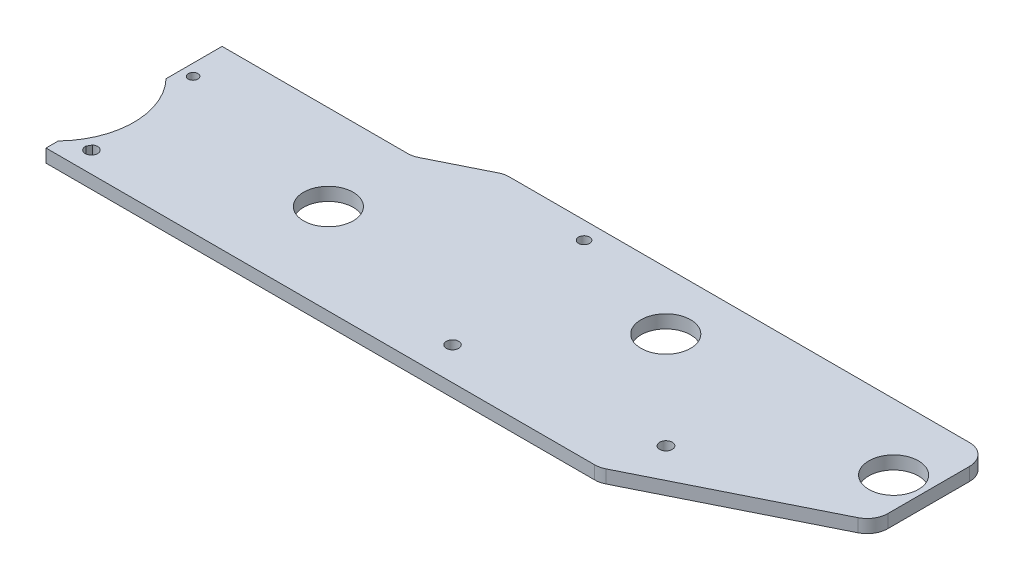
ISO-10303-21;
HEADER;
FILE_DESCRIPTION(('STEP AP214'),'2;1');
FILE_NAME('part.step','',(''),(''),'','','');
FILE_SCHEMA(('AUTOMOTIVE_DESIGN { 1 0 10303 214 1 1 1 1 }'));
ENDSEC;
DATA;
#1=APPLICATION_CONTEXT('core data for automotive mechanical design processes');
#2=APPLICATION_PROTOCOL_DEFINITION('international standard','automotive_design',2000,#1);
#3=PRODUCT_CONTEXT('',#1,'mechanical');
#4=PRODUCT('Part','Part','',(#3));
#5=PRODUCT_RELATED_PRODUCT_CATEGORY('part','',(#4));
#6=PRODUCT_DEFINITION_FORMATION('','',#4);
#7=PRODUCT_DEFINITION_CONTEXT('part definition',#1,'design');
#8=PRODUCT_DEFINITION('design','',#6,#7);
#9=PRODUCT_DEFINITION_SHAPE('','',#8);
#10=(LENGTH_UNIT() NAMED_UNIT(*) SI_UNIT(.MILLI.,.METRE.));
#11=(NAMED_UNIT(*) PLANE_ANGLE_UNIT() SI_UNIT($,.RADIAN.));
#12=(NAMED_UNIT(*) SI_UNIT($,.STERADIAN.) SOLID_ANGLE_UNIT());
#13=UNCERTAINTY_MEASURE_WITH_UNIT(LENGTH_MEASURE(1.E-05),#10,'distance_accuracy_value','');
#14=(GEOMETRIC_REPRESENTATION_CONTEXT(3) GLOBAL_UNCERTAINTY_ASSIGNED_CONTEXT((#13)) GLOBAL_UNIT_ASSIGNED_CONTEXT((#10,
#11,#12)) REPRESENTATION_CONTEXT('',''));
#15=CARTESIAN_POINT('',(0.,0.,0.));
#16=DIRECTION('',(0.,0.,1.));
#17=DIRECTION('',(1.,0.,0.));
#18=AXIS2_PLACEMENT_3D('',#15,#16,#17);
#19=CARTESIAN_POINT('',(77.654770619872,-6.825,7.40281206338842));
#20=DIRECTION('',(0.,0.,1.));
#21=DIRECTION('',(1.,0.,0.));
#22=AXIS2_PLACEMENT_3D('',#19,#20,#21);
#23=PLANE('',#22);
#24=DIRECTION('',(1.,0.,0.));
#25=VECTOR('',#24,1.);
#26=CARTESIAN_POINT('',(0.,0.,7.40281206338842));
#27=LINE('',#26,#25);
#28=CARTESIAN_POINT('',(31.6014705087354,0.,7.40281206338842));
#29=VERTEX_POINT('',#28);
#30=CARTESIAN_POINT('',(76.4795591487987,0.,7.40281206338842));
#31=VERTEX_POINT('',#30);
#32=EDGE_CURVE('E293',#29,#31,#27,.T.);
#33=ORIENTED_EDGE('',*,*,#32,.F.);
#34=DIRECTION('',(0.,1.,0.));
#35=VECTOR('',#34,1.);
#36=CARTESIAN_POINT('',(31.6014705087354,-6.825,7.40281206338842));
#37=LINE('',#36,#35);
#38=CARTESIAN_POINT('',(31.6014705087354,3.175,7.40281206338842));
#39=VERTEX_POINT('',#38);
#40=EDGE_CURVE('E261',#29,#39,#37,.T.);
#41=ORIENTED_EDGE('',*,*,#40,.T.);
#42=DIRECTION('',(1.,0.,0.));
#43=VECTOR('',#42,1.);
#44=CARTESIAN_POINT('',(77.654770619872,3.175,7.40281206338842));
#45=LINE('',#44,#43);
#46=CARTESIAN_POINT('',(76.4795591487987,3.175,7.40281206338842));
#47=VERTEX_POINT('',#46);
#48=EDGE_CURVE('E154',#39,#47,#45,.T.);
#49=ORIENTED_EDGE('',*,*,#48,.T.);
#50=DIRECTION('',(0.,1.,0.));
#51=VECTOR('',#50,1.);
#52=CARTESIAN_POINT('',(76.4795591487987,0.,7.40281206338842));
#53=LINE('',#52,#51);
#54=EDGE_CURVE('E221',#47,#31,#53,.F.);
#55=ORIENTED_EDGE('',*,*,#54,.T.);
#56=EDGE_LOOP('',(#33,#41,#49,#55));
#57=FACE_BOUND('',#56,.T.);
#58=ADVANCED_FACE('F37',(#57),#23,.F.);
#59=CARTESIAN_POINT('',(0.,3.175,0.));
#60=DIRECTION('',(0.,1.,0.));
#61=DIRECTION('',(0.,0.,1.));
#62=AXIS2_PLACEMENT_3D('',#59,#60,#61);
#63=PLANE('',#62);
#64=DIRECTION('',(0.,0.,-1.));
#65=VECTOR('',#64,1.);
#66=CARTESIAN_POINT('',(31.6014705087354,3.175,50.));
#67=LINE('',#66,#65);
#68=CARTESIAN_POINT('',(31.6014705087354,3.175,50.));
#69=VERTEX_POINT('',#68);
#70=CARTESIAN_POINT('',(31.6014705087354,3.175,47.0507662610285));
#71=VERTEX_POINT('',#70);
#72=EDGE_CURVE('E52',#69,#71,#67,.T.);
#73=ORIENTED_EDGE('',*,*,#72,.F.);
#74=DIRECTION('',(1.,0.,0.));
#75=VECTOR('',#74,1.);
#76=CARTESIAN_POINT('',(0.,3.175,50.));
#77=LINE('',#76,#75);
#78=CARTESIAN_POINT('',(164.327666523127,3.175,50.));
#79=VERTEX_POINT('',#78);
#80=EDGE_CURVE('E161',#69,#79,#77,.T.);
#81=ORIENTED_EDGE('',*,*,#80,.T.);
#82=CARTESIAN_POINT('',(164.327666523127,3.175,45.));
#83=DIRECTION('',(0.,1.,0.));
#84=DIRECTION('',(0.,0.,1.));
#85=AXIS2_PLACEMENT_3D('',#82,#83,#84);
#86=CIRCLE('',#85,5.);
#87=CARTESIAN_POINT('',(166.555038564004,3.175,49.4764733654425));
#88=VERTEX_POINT('',#87);
#89=EDGE_CURVE('E213',#79,#88,#86,.T.);
#90=ORIENTED_EDGE('',*,*,#89,.T.);
#91=DIRECTION('',(-0.895294673088504,0.,0.445474408175541));
#92=VECTOR('',#91,1.);
#93=CARTESIAN_POINT('',(210.,3.175,27.8594359076578));
#94=LINE('',#93,#92);
#95=CARTESIAN_POINT('',(207.227372040878,3.175,29.2390205699011));
#96=VERTEX_POINT('',#95);
#97=EDGE_CURVE('E280',#96,#88,#94,.T.);
#98=ORIENTED_EDGE('',*,*,#97,.F.);
#99=CARTESIAN_POINT('',(205.,3.175,24.7625472044585));
#100=DIRECTION('',(0.,1.,0.));
#101=DIRECTION('',(0.,0.,1.));
#102=AXIS2_PLACEMENT_3D('',#99,#100,#101);
#103=CIRCLE('',#102,5.);
#104=CARTESIAN_POINT('',(210.,3.175,24.7625472044585));
#105=VERTEX_POINT('',#104);
#106=EDGE_CURVE('E215',#96,#105,#103,.T.);
#107=ORIENTED_EDGE('',*,*,#106,.T.);
#108=DIRECTION('',(0.,0.,-1.));
#109=VECTOR('',#108,1.);
#110=CARTESIAN_POINT('',(210.,3.175,0.));
#111=LINE('',#110,#109);
#112=CARTESIAN_POINT('',(210.,3.175,5.));
#113=VERTEX_POINT('',#112);
#114=EDGE_CURVE('E172',#105,#113,#111,.T.);
#115=ORIENTED_EDGE('',*,*,#114,.T.);
#116=CARTESIAN_POINT('',(205.,3.175,5.));
#117=DIRECTION('',(0.,1.,0.));
#118=DIRECTION('',(0.,0.,1.));
#119=AXIS2_PLACEMENT_3D('',#116,#117,#118);
#120=CIRCLE('',#119,5.);
#121=CARTESIAN_POINT('',(205.,3.175,0.));
#122=VERTEX_POINT('',#121);
#123=EDGE_CURVE('E217',#113,#122,#120,.T.);
#124=ORIENTED_EDGE('',*,*,#123,.T.);
#125=DIRECTION('',(-1.,0.,0.));
#126=VECTOR('',#125,1.);
#127=CARTESIAN_POINT('',(0.,3.175,0.));
#128=LINE('',#127,#126);
#129=CARTESIAN_POINT('',(93.707824868426,3.175,0.));
#130=VERTEX_POINT('',#129);
#131=EDGE_CURVE('E176',#122,#130,#128,.T.);
#132=ORIENTED_EDGE('',*,*,#131,.T.);
#133=CARTESIAN_POINT('',(93.707824868426,3.175,5.));
#134=DIRECTION('',(0.,1.,0.));
#135=DIRECTION('',(0.,0.,1.));
#136=AXIS2_PLACEMENT_3D('',#133,#134,#135);
#137=CIRCLE('',#136,5.);
#138=CARTESIAN_POINT('',(91.4804528275483,3.175,0.523526634557481));
#139=VERTEX_POINT('',#138);
#140=EDGE_CURVE('E219',#130,#139,#137,.T.);
#141=ORIENTED_EDGE('',*,*,#140,.T.);
#142=DIRECTION('',(0.895294673088504,0.,-0.445474408175541));
#143=VECTOR('',#142,1.);
#144=CARTESIAN_POINT('',(92.5326133973527,3.175,0.));
#145=LINE('',#144,#143);
#146=CARTESIAN_POINT('',(78.7069311896764,3.175,6.87928542883094));
#147=VERTEX_POINT('',#146);
#148=EDGE_CURVE('E284',#147,#139,#145,.T.);
#149=ORIENTED_EDGE('',*,*,#148,.F.);
#150=CARTESIAN_POINT('',(76.4795591487987,3.175,2.40281206338842));
#151=DIRECTION('',(0.,1.,0.));
#152=DIRECTION('',(0.,0.,1.));
#153=AXIS2_PLACEMENT_3D('',#150,#151,#152);
#154=CIRCLE('',#153,5.);
#155=EDGE_CURVE('E244',#147,#47,#154,.F.);
#156=ORIENTED_EDGE('',*,*,#155,.T.);
#157=ORIENTED_EDGE('',*,*,#48,.F.);
#158=CARTESIAN_POINT('',(31.6014705087354,3.175,20.9492337389715));
#159=VERTEX_POINT('',#158);
#160=EDGE_CURVE('E166',#159,#39,#67,.T.);
#161=ORIENTED_EDGE('',*,*,#160,.F.);
#162=CARTESIAN_POINT('',(18.,3.175,34.));
#163=DIRECTION('',(0.,1.,0.));
#164=DIRECTION('',(0.,0.,1.));
#165=AXIS2_PLACEMENT_3D('',#162,#163,#164);
#166=CIRCLE('',#165,18.85);
#167=EDGE_CURVE('E165',#71,#159,#166,.T.);
#168=ORIENTED_EDGE('',*,*,#167,.F.);
#169=EDGE_LOOP('',(#73,#81,#90,#98,#107,#115,#124,#132,#141,#149,#156,#157,#161,#168));
#170=FACE_BOUND('',#169,.T.);
#171=CARTESIAN_POINT('',(122.,3.175,42.0581398050981));
#172=DIRECTION('',(0.,1.,0.));
#173=DIRECTION('',(0.,0.,1.));
#174=AXIS2_PLACEMENT_3D('',#171,#172,#173);
#175=CIRCLE('',#174,1.5);
#176=CARTESIAN_POINT('',(122.,3.175,43.5581398050981));
#177=VERTEX_POINT('',#176);
#178=EDGE_CURVE('E251',#177,#177,#175,.T.);
#179=ORIENTED_EDGE('',*,*,#178,.F.);
#180=EDGE_LOOP('',(#179));
#181=FACE_BOUND('',#180,.T.);
#182=CARTESIAN_POINT('',(37.5207499584055,3.175,44.9211981208464));
#183=DIRECTION('',(0.,1.,0.));
#184=DIRECTION('',(0.,0.,1.));
#185=AXIS2_PLACEMENT_3D('',#182,#183,#184);
#186=CIRCLE('',#185,1.5);
#187=CARTESIAN_POINT('',(36.028479152304,3.175,44.7691197158792));
#188=VERTEX_POINT('',#187);
#189=CARTESIAN_POINT('',(36.6103540196022,3.175,43.7290658988968));
#190=VERTEX_POINT('',#189);
#191=EDGE_CURVE('E315',#188,#190,#186,.T.);
#192=ORIENTED_EDGE('',*,*,#191,.F.);
#193=CARTESIAN_POINT('',(18.,3.175,34.));
#194=DIRECTION('',(0.,1.,0.));
#195=DIRECTION('',(0.,0.,1.));
#196=AXIS2_PLACEMENT_3D('',#193,#194,#195);
#197=CIRCLE('',#196,21.);
#198=EDGE_CURVE('E268',#188,#190,#197,.T.);
#199=ORIENTED_EDGE('',*,*,#198,.T.);
#200=EDGE_LOOP('',(#192,#199));
#201=FACE_BOUND('',#200,.T.);
#202=CARTESIAN_POINT('',(145.531297368261,3.175,14.));
#203=DIRECTION('',(0.,1.,0.));
#204=DIRECTION('',(0.,0.,1.));
#205=AXIS2_PLACEMENT_3D('',#202,#203,#204);
#206=CIRCLE('',#205,6.00000000000002);
#207=CARTESIAN_POINT('',(145.531297368261,3.175,20.));
#208=VERTEX_POINT('',#207);
#209=EDGE_CURVE('E295',#208,#208,#206,.T.);
#210=ORIENTED_EDGE('',*,*,#209,.F.);
#211=EDGE_LOOP('',(#210));
#212=FACE_BOUND('',#211,.T.);
#213=CARTESIAN_POINT('',(202.646291021416,3.175,16.));
#214=DIRECTION('',(0.,1.,0.));
#215=DIRECTION('',(0.,0.,1.));
#216=AXIS2_PLACEMENT_3D('',#213,#214,#215);
#217=CIRCLE('',#216,6.00000000000002);
#218=CARTESIAN_POINT('',(202.646291021416,3.175,22.));
#219=VERTEX_POINT('',#218);
#220=EDGE_CURVE('E296',#219,#219,#217,.T.);
#221=ORIENTED_EDGE('',*,*,#220,.F.);
#222=EDGE_LOOP('',(#221));
#223=FACE_BOUND('',#222,.T.);
#224=CARTESIAN_POINT('',(78.0102637901218,3.175,28.1));
#225=DIRECTION('',(0.,1.,0.));
#226=DIRECTION('',(0.,0.,1.));
#227=AXIS2_PLACEMENT_3D('',#224,#225,#226);
#228=CIRCLE('',#227,6.);
#229=CARTESIAN_POINT('',(78.0102637901218,3.175,34.1));
#230=VERTEX_POINT('',#229);
#231=EDGE_CURVE('E196',#230,#230,#228,.T.);
#232=ORIENTED_EDGE('',*,*,#231,.F.);
#233=EDGE_LOOP('',(#232));
#234=FACE_BOUND('',#233,.T.);
#235=CARTESIAN_POINT('',(34.3725877204713,3.175,17.1940052448511));
#236=DIRECTION('',(0.,1.,0.));
#237=DIRECTION('',(0.,0.,1.));
#238=AXIS2_PLACEMENT_3D('',#235,#236,#237);
#239=CIRCLE('',#238,1.16561711842174);
#240=CARTESIAN_POINT('',(34.3725877204713,3.175,18.3596223632728));
#241=VERTEX_POINT('',#240);
#242=EDGE_CURVE('E189',#241,#241,#239,.T.);
#243=ORIENTED_EDGE('',*,*,#242,.F.);
#244=EDGE_LOOP('',(#243));
#245=FACE_BOUND('',#244,.T.);
#246=CARTESIAN_POINT('',(116.,3.175,4.23721477368133));
#247=DIRECTION('',(0.,1.,0.));
#248=DIRECTION('',(0.,0.,1.));
#249=AXIS2_PLACEMENT_3D('',#246,#247,#248);
#250=CIRCLE('',#249,1.33561412139621);
#251=CARTESIAN_POINT('',(116.,3.175,5.57282889507754));
#252=VERTEX_POINT('',#251);
#253=EDGE_CURVE('E309',#252,#252,#250,.T.);
#254=ORIENTED_EDGE('',*,*,#253,.F.);
#255=EDGE_LOOP('',(#254));
#256=FACE_BOUND('',#255,.T.);
#257=CARTESIAN_POINT('',(168.975233936324,3.175,37.4032096333009));
#258=DIRECTION('',(0.,1.,0.));
#259=DIRECTION('',(0.,0.,1.));
#260=AXIS2_PLACEMENT_3D('',#257,#258,#259);
#261=CIRCLE('',#260,1.51727390455077);
#262=CARTESIAN_POINT('',(168.975233936324,3.175,38.9204835378516));
#263=VERTEX_POINT('',#262);
#264=EDGE_CURVE('E303',#263,#263,#261,.T.);
#265=ORIENTED_EDGE('',*,*,#264,.F.);
#266=EDGE_LOOP('',(#265));
#267=FACE_BOUND('',#266,.T.);
#268=ADVANCED_FACE('F159',(#170,#181,#201,#212,#223,#234,#245,#256,#267),#63,.T.);
#269=CARTESIAN_POINT('',(0.,0.,0.));
#270=DIRECTION('',(0.,1.,0.));
#271=DIRECTION('',(0.,0.,1.));
#272=AXIS2_PLACEMENT_3D('',#269,#270,#271);
#273=PLANE('',#272);
#274=CARTESIAN_POINT('',(122.,0.,42.0581398050981));
#275=DIRECTION('',(0.,1.,0.));
#276=DIRECTION('',(0.,0.,1.));
#277=AXIS2_PLACEMENT_3D('',#274,#275,#276);
#278=CIRCLE('',#277,1.5);
#279=CARTESIAN_POINT('',(122.,0.,43.5581398050981));
#280=VERTEX_POINT('',#279);
#281=EDGE_CURVE('E249',#280,#280,#278,.T.);
#282=ORIENTED_EDGE('',*,*,#281,.T.);
#283=EDGE_LOOP('',(#282));
#284=FACE_BOUND('',#283,.T.);
#285=DIRECTION('',(1.,0.,0.));
#286=VECTOR('',#285,1.);
#287=CARTESIAN_POINT('',(0.,0.,50.));
#288=LINE('',#287,#286);
#289=CARTESIAN_POINT('',(31.6014705087354,0.,50.));
#290=VERTEX_POINT('',#289);
#291=CARTESIAN_POINT('',(164.327666523127,0.,50.));
#292=VERTEX_POINT('',#291);
#293=EDGE_CURVE('E187',#290,#292,#288,.T.);
#294=ORIENTED_EDGE('',*,*,#293,.F.);
#295=DIRECTION('',(0.,0.,-1.));
#296=VECTOR('',#295,1.);
#297=CARTESIAN_POINT('',(31.6014705087354,0.,0.));
#298=LINE('',#297,#296);
#299=CARTESIAN_POINT('',(31.6014705087354,0.,47.0507662610285));
#300=VERTEX_POINT('',#299);
#301=EDGE_CURVE('E150',#290,#300,#298,.T.);
#302=ORIENTED_EDGE('',*,*,#301,.T.);
#303=CARTESIAN_POINT('',(18.,0.,34.));
#304=DIRECTION('',(0.,1.,0.));
#305=DIRECTION('',(0.,0.,1.));
#306=AXIS2_PLACEMENT_3D('',#303,#304,#305);
#307=CIRCLE('',#306,18.85);
#308=CARTESIAN_POINT('',(31.6014705087354,0.,20.9492337389715));
#309=VERTEX_POINT('',#308);
#310=EDGE_CURVE('E256',#300,#309,#307,.T.);
#311=ORIENTED_EDGE('',*,*,#310,.T.);
#312=EDGE_CURVE('E60',#309,#29,#298,.T.);
#313=ORIENTED_EDGE('',*,*,#312,.T.);
#314=ORIENTED_EDGE('',*,*,#32,.T.);
#315=CARTESIAN_POINT('',(76.4795591487987,0.,2.40281206338842));
#316=DIRECTION('',(0.,1.,0.));
#317=DIRECTION('',(0.,0.,1.));
#318=AXIS2_PLACEMENT_3D('',#315,#316,#317);
#319=CIRCLE('',#318,5.);
#320=CARTESIAN_POINT('',(78.7069311896765,0.,6.87928542883095));
#321=VERTEX_POINT('',#320);
#322=EDGE_CURVE('E247',#31,#321,#319,.T.);
#323=ORIENTED_EDGE('',*,*,#322,.T.);
#324=DIRECTION('',(0.895294673088504,0.,-0.445474408175541));
#325=VECTOR('',#324,1.);
#326=CARTESIAN_POINT('',(18.362861016876,0.,36.9048622083704));
#327=LINE('',#326,#325);
#328=CARTESIAN_POINT('',(91.4804528275483,0.,0.523526634557479));
#329=VERTEX_POINT('',#328);
#330=EDGE_CURVE('E283',#321,#329,#327,.T.);
#331=ORIENTED_EDGE('',*,*,#330,.T.);
#332=CARTESIAN_POINT('',(93.707824868426,0.,5.));
#333=DIRECTION('',(0.,1.,0.));
#334=DIRECTION('',(0.,0.,1.));
#335=AXIS2_PLACEMENT_3D('',#332,#333,#334);
#336=CIRCLE('',#335,5.);
#337=CARTESIAN_POINT('',(93.707824868426,0.,0.));
#338=VERTEX_POINT('',#337);
#339=EDGE_CURVE('E211',#329,#338,#336,.F.);
#340=ORIENTED_EDGE('',*,*,#339,.T.);
#341=DIRECTION('',(-1.,0.,0.));
#342=VECTOR('',#341,1.);
#343=CARTESIAN_POINT('',(0.,0.,0.));
#344=LINE('',#343,#342);
#345=CARTESIAN_POINT('',(205.,0.,0.));
#346=VERTEX_POINT('',#345);
#347=EDGE_CURVE('E173',#346,#338,#344,.T.);
#348=ORIENTED_EDGE('',*,*,#347,.F.);
#349=CARTESIAN_POINT('',(205.,0.,5.));
#350=DIRECTION('',(0.,1.,0.));
#351=DIRECTION('',(0.,0.,1.));
#352=AXIS2_PLACEMENT_3D('',#349,#350,#351);
#353=CIRCLE('',#352,5.);
#354=CARTESIAN_POINT('',(210.,0.,5.));
#355=VERTEX_POINT('',#354);
#356=EDGE_CURVE('E209',#346,#355,#353,.F.);
#357=ORIENTED_EDGE('',*,*,#356,.T.);
#358=DIRECTION('',(0.,0.,-1.));
#359=VECTOR('',#358,1.);
#360=CARTESIAN_POINT('',(210.,0.,0.));
#361=LINE('',#360,#359);
#362=CARTESIAN_POINT('',(210.,0.,24.7625472044585));
#363=VERTEX_POINT('',#362);
#364=EDGE_CURVE('E179',#363,#355,#361,.T.);
#365=ORIENTED_EDGE('',*,*,#364,.F.);
#366=CARTESIAN_POINT('',(205.,0.,24.7625472044585));
#367=DIRECTION('',(0.,1.,0.));
#368=DIRECTION('',(0.,0.,1.));
#369=AXIS2_PLACEMENT_3D('',#366,#367,#368);
#370=CIRCLE('',#369,5.);
#371=CARTESIAN_POINT('',(207.227372040878,0.,29.2390205699011));
#372=VERTEX_POINT('',#371);
#373=EDGE_CURVE('E207',#363,#372,#370,.F.);
#374=ORIENTED_EDGE('',*,*,#373,.T.);
#375=DIRECTION('',(-0.895294673088504,0.,0.445474408175541));
#376=VECTOR('',#375,1.);
#377=CARTESIAN_POINT('',(52.7851670626083,0.,106.085283513341));
#378=LINE('',#377,#376);
#379=CARTESIAN_POINT('',(166.555038564004,0.,49.4764733654425));
#380=VERTEX_POINT('',#379);
#381=EDGE_CURVE('E290',#372,#380,#378,.T.);
#382=ORIENTED_EDGE('',*,*,#381,.T.);
#383=CARTESIAN_POINT('',(164.327666523127,0.,45.));
#384=DIRECTION('',(0.,1.,0.));
#385=DIRECTION('',(0.,0.,1.));
#386=AXIS2_PLACEMENT_3D('',#383,#384,#385);
#387=CIRCLE('',#386,5.);
#388=EDGE_CURVE('E204',#380,#292,#387,.F.);
#389=ORIENTED_EDGE('',*,*,#388,.T.);
#390=EDGE_LOOP('',(#294,#302,#311,#313,#314,#323,#331,#340,#348,#357,#365,#374,#382,#389));
#391=FACE_BOUND('',#390,.T.);
#392=CARTESIAN_POINT('',(18.,0.,34.));
#393=DIRECTION('',(0.,1.,0.));
#394=DIRECTION('',(0.,0.,1.));
#395=AXIS2_PLACEMENT_3D('',#392,#393,#394);
#396=CIRCLE('',#395,21.);
#397=CARTESIAN_POINT('',(36.028479152304,0.,44.7691197158792));
#398=VERTEX_POINT('',#397);
#399=CARTESIAN_POINT('',(36.6103540196022,0.,43.7290658988968));
#400=VERTEX_POINT('',#399);
#401=EDGE_CURVE('E270',#398,#400,#396,.T.);
#402=ORIENTED_EDGE('',*,*,#401,.F.);
#403=CARTESIAN_POINT('',(37.5207499584055,0.,44.9211981208464));
#404=DIRECTION('',(0.,1.,0.));
#405=DIRECTION('',(0.,0.,1.));
#406=AXIS2_PLACEMENT_3D('',#403,#404,#405);
#407=CIRCLE('',#406,1.5);
#408=EDGE_CURVE('E312',#398,#400,#407,.T.);
#409=ORIENTED_EDGE('',*,*,#408,.T.);
#410=EDGE_LOOP('',(#402,#409));
#411=FACE_BOUND('',#410,.T.);
#412=CARTESIAN_POINT('',(145.531297368261,0.,14.));
#413=DIRECTION('',(0.,1.,0.));
#414=DIRECTION('',(0.,0.,1.));
#415=AXIS2_PLACEMENT_3D('',#412,#413,#414);
#416=CIRCLE('',#415,6.00000000000002);
#417=CARTESIAN_POINT('',(145.531297368261,0.,20.));
#418=VERTEX_POINT('',#417);
#419=EDGE_CURVE('E199',#418,#418,#416,.T.);
#420=ORIENTED_EDGE('',*,*,#419,.T.);
#421=EDGE_LOOP('',(#420));
#422=FACE_BOUND('',#421,.T.);
#423=CARTESIAN_POINT('',(202.646291021416,0.,16.));
#424=DIRECTION('',(0.,1.,0.));
#425=DIRECTION('',(0.,0.,1.));
#426=AXIS2_PLACEMENT_3D('',#423,#424,#425);
#427=CIRCLE('',#426,6.00000000000002);
#428=CARTESIAN_POINT('',(202.646291021416,0.,22.));
#429=VERTEX_POINT('',#428);
#430=EDGE_CURVE('E195',#429,#429,#427,.T.);
#431=ORIENTED_EDGE('',*,*,#430,.T.);
#432=EDGE_LOOP('',(#431));
#433=FACE_BOUND('',#432,.T.);
#434=CARTESIAN_POINT('',(78.0102637901218,0.,28.1));
#435=DIRECTION('',(0.,1.,0.));
#436=DIRECTION('',(0.,0.,1.));
#437=AXIS2_PLACEMENT_3D('',#434,#435,#436);
#438=CIRCLE('',#437,6.);
#439=CARTESIAN_POINT('',(78.0102637901218,0.,34.1));
#440=VERTEX_POINT('',#439);
#441=EDGE_CURVE('E192',#440,#440,#438,.T.);
#442=ORIENTED_EDGE('',*,*,#441,.T.);
#443=EDGE_LOOP('',(#442));
#444=FACE_BOUND('',#443,.T.);
#445=CARTESIAN_POINT('',(34.3725877204713,0.,17.1940052448511));
#446=DIRECTION('',(0.,1.,0.));
#447=DIRECTION('',(0.,0.,1.));
#448=AXIS2_PLACEMENT_3D('',#445,#446,#447);
#449=CIRCLE('',#448,1.16561711842174);
#450=CARTESIAN_POINT('',(34.3725877204713,0.,18.3596223632728));
#451=VERTEX_POINT('',#450);
#452=EDGE_CURVE('E182',#451,#451,#449,.T.);
#453=ORIENTED_EDGE('',*,*,#452,.T.);
#454=EDGE_LOOP('',(#453));
#455=FACE_BOUND('',#454,.T.);
#456=CARTESIAN_POINT('',(116.,0.,4.23721477368133));
#457=DIRECTION('',(0.,1.,0.));
#458=DIRECTION('',(0.,0.,1.));
#459=AXIS2_PLACEMENT_3D('',#456,#457,#458);
#460=CIRCLE('',#459,1.33561412139621);
#461=CARTESIAN_POINT('',(116.,0.,5.57282889507754));
#462=VERTEX_POINT('',#461);
#463=EDGE_CURVE('E306',#462,#462,#460,.T.);
#464=ORIENTED_EDGE('',*,*,#463,.T.);
#465=EDGE_LOOP('',(#464));
#466=FACE_BOUND('',#465,.T.);
#467=CARTESIAN_POINT('',(168.975233936324,0.,37.4032096333009));
#468=DIRECTION('',(0.,1.,0.));
#469=DIRECTION('',(0.,0.,1.));
#470=AXIS2_PLACEMENT_3D('',#467,#468,#469);
#471=CIRCLE('',#470,1.51727390455077);
#472=CARTESIAN_POINT('',(168.975233936324,0.,38.9204835378516));
#473=VERTEX_POINT('',#472);
#474=EDGE_CURVE('E202',#473,#473,#471,.T.);
#475=ORIENTED_EDGE('',*,*,#474,.T.);
#476=EDGE_LOOP('',(#475));
#477=FACE_BOUND('',#476,.T.);
#478=ADVANCED_FACE('F258',(#284,#391,#411,#422,#433,#444,#455,#466,#477),#273,.F.);
#479=CARTESIAN_POINT('',(0.,3.175,50.));
#480=DIRECTION('',(0.,0.,-1.));
#481=DIRECTION('',(-1.,0.,0.));
#482=AXIS2_PLACEMENT_3D('',#479,#480,#481);
#483=PLANE('',#482);
#484=ORIENTED_EDGE('',*,*,#80,.F.);
#485=DIRECTION('',(0.,1.,0.));
#486=VECTOR('',#485,1.);
#487=CARTESIAN_POINT('',(31.6014705087354,0.,50.));
#488=LINE('',#487,#486);
#489=EDGE_CURVE('E147',#69,#290,#488,.F.);
#490=ORIENTED_EDGE('',*,*,#489,.T.);
#491=ORIENTED_EDGE('',*,*,#293,.T.);
#492=DIRECTION('',(0.,1.,0.));
#493=VECTOR('',#492,1.);
#494=CARTESIAN_POINT('',(164.327666523127,3.175,50.));
#495=LINE('',#494,#493);
#496=EDGE_CURVE('E171',#292,#79,#495,.T.);
#497=ORIENTED_EDGE('',*,*,#496,.T.);
#498=EDGE_LOOP('',(#484,#490,#491,#497));
#499=FACE_BOUND('',#498,.T.);
#500=ADVANCED_FACE('F169',(#499),#483,.F.);
#501=CARTESIAN_POINT('',(210.,3.175,0.));
#502=DIRECTION('',(-1.,0.,0.));
#503=DIRECTION('',(0.,0.,1.));
#504=AXIS2_PLACEMENT_3D('',#501,#502,#503);
#505=PLANE('',#504);
#506=ORIENTED_EDGE('',*,*,#364,.T.);
#507=DIRECTION('',(0.,-1.,0.));
#508=VECTOR('',#507,1.);
#509=CARTESIAN_POINT('',(210.,3.175,5.));
#510=LINE('',#509,#508);
#511=EDGE_CURVE('E238',#355,#113,#510,.F.);
#512=ORIENTED_EDGE('',*,*,#511,.T.);
#513=ORIENTED_EDGE('',*,*,#114,.F.);
#514=DIRECTION('',(0.,-1.,0.));
#515=VECTOR('',#514,1.);
#516=CARTESIAN_POINT('',(210.,3.175,24.7625472044585));
#517=LINE('',#516,#515);
#518=EDGE_CURVE('E235',#105,#363,#517,.T.);
#519=ORIENTED_EDGE('',*,*,#518,.T.);
#520=EDGE_LOOP('',(#506,#512,#513,#519));
#521=FACE_BOUND('',#520,.T.);
#522=ADVANCED_FACE('F338',(#521),#505,.F.);
#523=CARTESIAN_POINT('',(0.,3.175,0.));
#524=DIRECTION('',(0.,0.,1.));
#525=DIRECTION('',(1.,0.,0.));
#526=AXIS2_PLACEMENT_3D('',#523,#524,#525);
#527=PLANE('',#526);
#528=ORIENTED_EDGE('',*,*,#347,.T.);
#529=DIRECTION('',(0.,1.,0.));
#530=VECTOR('',#529,1.);
#531=CARTESIAN_POINT('',(93.707824868426,3.175,0.));
#532=LINE('',#531,#530);
#533=EDGE_CURVE('E232',#338,#130,#532,.T.);
#534=ORIENTED_EDGE('',*,*,#533,.T.);
#535=ORIENTED_EDGE('',*,*,#131,.F.);
#536=DIRECTION('',(0.,-1.,0.));
#537=VECTOR('',#536,1.);
#538=CARTESIAN_POINT('',(205.,3.175,0.));
#539=LINE('',#538,#537);
#540=EDGE_CURVE('E229',#122,#346,#539,.T.);
#541=ORIENTED_EDGE('',*,*,#540,.T.);
#542=EDGE_LOOP('',(#528,#534,#535,#541));
#543=FACE_BOUND('',#542,.T.);
#544=ADVANCED_FACE('F329',(#543),#527,.F.);
#545=CARTESIAN_POINT('',(34.3725877204713,3.175,17.1940052448511));
#546=DIRECTION('',(0.,-1.,0.));
#547=DIRECTION('',(0.,0.,-1.));
#548=AXIS2_PLACEMENT_3D('',#545,#546,#547);
#549=CYLINDRICAL_SURFACE('',#548,1.16561711842174);
#550=ORIENTED_EDGE('',*,*,#242,.T.);
#551=EDGE_LOOP('',(#550));
#552=FACE_BOUND('',#551,.T.);
#553=ORIENTED_EDGE('',*,*,#452,.F.);
#554=EDGE_LOOP('',(#553));
#555=FACE_BOUND('',#554,.T.);
#556=ADVANCED_FACE('F326',(#552,#555),#549,.F.);
#557=CARTESIAN_POINT('',(37.5207499584055,3.175,44.9211981208464));
#558=DIRECTION('',(0.,-1.,0.));
#559=DIRECTION('',(0.,0.,-1.));
#560=AXIS2_PLACEMENT_3D('',#557,#558,#559);
#561=CYLINDRICAL_SURFACE('',#560,1.5);
#562=DIRECTION('',(0.,1.,0.));
#563=VECTOR('',#562,1.);
#564=CARTESIAN_POINT('',(36.6103540196022,1.5875,43.7290658988968));
#565=LINE('',#564,#563);
#566=EDGE_CURVE('E155',#400,#190,#565,.T.);
#567=ORIENTED_EDGE('',*,*,#566,.F.);
#568=ORIENTED_EDGE('',*,*,#408,.F.);
#569=DIRECTION('',(0.,1.,0.));
#570=VECTOR('',#569,1.);
#571=CARTESIAN_POINT('',(36.028479152304,1.5875,44.7691197158792));
#572=LINE('',#571,#570);
#573=EDGE_CURVE('E273',#188,#398,#572,.F.);
#574=ORIENTED_EDGE('',*,*,#573,.F.);
#575=ORIENTED_EDGE('',*,*,#191,.T.);
#576=EDGE_LOOP('',(#567,#568,#574,#575));
#577=FACE_BOUND('',#576,.T.);
#578=ADVANCED_FACE('F328',(#577),#561,.F.);
#579=CARTESIAN_POINT('',(116.,3.175,4.23721477368133));
#580=DIRECTION('',(0.,-1.,0.));
#581=DIRECTION('',(0.,0.,-1.));
#582=AXIS2_PLACEMENT_3D('',#579,#580,#581);
#583=CYLINDRICAL_SURFACE('',#582,1.33561412139621);
#584=ORIENTED_EDGE('',*,*,#253,.T.);
#585=EDGE_LOOP('',(#584));
#586=FACE_BOUND('',#585,.T.);
#587=ORIENTED_EDGE('',*,*,#463,.F.);
#588=EDGE_LOOP('',(#587));
#589=FACE_BOUND('',#588,.T.);
#590=ADVANCED_FACE('F335',(#586,#589),#583,.F.);
#591=CARTESIAN_POINT('',(168.975233936324,3.175,37.4032096333009));
#592=DIRECTION('',(0.,-1.,0.));
#593=DIRECTION('',(0.,0.,-1.));
#594=AXIS2_PLACEMENT_3D('',#591,#592,#593);
#595=CYLINDRICAL_SURFACE('',#594,1.51727390455077);
#596=ORIENTED_EDGE('',*,*,#264,.T.);
#597=EDGE_LOOP('',(#596));
#598=FACE_BOUND('',#597,.T.);
#599=ORIENTED_EDGE('',*,*,#474,.F.);
#600=EDGE_LOOP('',(#599));
#601=FACE_BOUND('',#600,.T.);
#602=ADVANCED_FACE('F365',(#598,#601),#595,.F.);
#603=CARTESIAN_POINT('',(78.0102637901218,-53.975,28.1));
#604=DIRECTION('',(0.,1.,0.));
#605=DIRECTION('',(0.,0.,1.));
#606=AXIS2_PLACEMENT_3D('',#603,#604,#605);
#607=CYLINDRICAL_SURFACE('',#606,6.);
#608=ORIENTED_EDGE('',*,*,#231,.T.);
#609=EDGE_LOOP('',(#608));
#610=FACE_BOUND('',#609,.T.);
#611=ORIENTED_EDGE('',*,*,#441,.F.);
#612=EDGE_LOOP('',(#611));
#613=FACE_BOUND('',#612,.T.);
#614=ADVANCED_FACE('F358',(#610,#613),#607,.F.);
#615=CARTESIAN_POINT('',(202.646291021416,-53.975,16.));
#616=DIRECTION('',(0.,1.,0.));
#617=DIRECTION('',(0.,0.,1.));
#618=AXIS2_PLACEMENT_3D('',#615,#616,#617);
#619=CYLINDRICAL_SURFACE('',#618,6.00000000000002);
#620=ORIENTED_EDGE('',*,*,#220,.T.);
#621=EDGE_LOOP('',(#620));
#622=FACE_BOUND('',#621,.T.);
#623=ORIENTED_EDGE('',*,*,#430,.F.);
#624=EDGE_LOOP('',(#623));
#625=FACE_BOUND('',#624,.T.);
#626=ADVANCED_FACE('F354',(#622,#625),#619,.F.);
#627=CARTESIAN_POINT('',(145.531297368261,-53.975,14.));
#628=DIRECTION('',(0.,1.,0.));
#629=DIRECTION('',(0.,0.,1.));
#630=AXIS2_PLACEMENT_3D('',#627,#628,#629);
#631=CYLINDRICAL_SURFACE('',#630,6.00000000000002);
#632=ORIENTED_EDGE('',*,*,#209,.T.);
#633=EDGE_LOOP('',(#632));
#634=FACE_BOUND('',#633,.T.);
#635=ORIENTED_EDGE('',*,*,#419,.F.);
#636=EDGE_LOOP('',(#635));
#637=FACE_BOUND('',#636,.T.);
#638=ADVANCED_FACE('F357',(#634,#637),#631,.F.);
#639=CARTESIAN_POINT('',(92.5326133973527,-6.825,0.));
#640=DIRECTION('',(0.445474408175541,0.,0.895294673088504));
#641=DIRECTION('',(0.895294673088504,0.,-0.445474408175541));
#642=AXIS2_PLACEMENT_3D('',#639,#640,#641);
#643=PLANE('',#642);
#644=ORIENTED_EDGE('',*,*,#330,.F.);
#645=DIRECTION('',(0.,1.,0.));
#646=VECTOR('',#645,1.);
#647=CARTESIAN_POINT('',(78.7069311896764,3.175,6.87928542883094));
#648=LINE('',#647,#646);
#649=EDGE_CURVE('E226',#321,#147,#648,.T.);
#650=ORIENTED_EDGE('',*,*,#649,.T.);
#651=ORIENTED_EDGE('',*,*,#148,.T.);
#652=DIRECTION('',(0.,1.,0.));
#653=VECTOR('',#652,1.);
#654=CARTESIAN_POINT('',(91.4804528275483,-6.825,0.52352663455748));
#655=LINE('',#654,#653);
#656=EDGE_CURVE('E224',#139,#329,#655,.F.);
#657=ORIENTED_EDGE('',*,*,#656,.T.);
#658=EDGE_LOOP('',(#644,#650,#651,#657));
#659=FACE_BOUND('',#658,.T.);
#660=ADVANCED_FACE('F352',(#659),#643,.F.);
#661=CARTESIAN_POINT('',(210.,-6.825,27.8594359076578));
#662=DIRECTION('',(-0.445474408175541,0.,-0.895294673088504));
#663=DIRECTION('',(-0.895294673088504,0.,0.445474408175541));
#664=AXIS2_PLACEMENT_3D('',#661,#662,#663);
#665=PLANE('',#664);
#666=ORIENTED_EDGE('',*,*,#381,.F.);
#667=DIRECTION('',(0.,-1.,0.));
#668=VECTOR('',#667,1.);
#669=CARTESIAN_POINT('',(207.227372040878,-6.825,29.2390205699011));
#670=LINE('',#669,#668);
#671=EDGE_CURVE('E242',#372,#96,#670,.F.);
#672=ORIENTED_EDGE('',*,*,#671,.T.);
#673=ORIENTED_EDGE('',*,*,#97,.T.);
#674=DIRECTION('',(0.,1.,0.));
#675=VECTOR('',#674,1.);
#676=CARTESIAN_POINT('',(166.555038564004,-6.825,49.4764733654425));
#677=LINE('',#676,#675);
#678=EDGE_CURVE('E240',#88,#380,#677,.F.);
#679=ORIENTED_EDGE('',*,*,#678,.T.);
#680=EDGE_LOOP('',(#666,#672,#673,#679));
#681=FACE_BOUND('',#680,.T.);
#682=ADVANCED_FACE('F395',(#681),#665,.F.);
#683=CARTESIAN_POINT('',(76.4795591487987,-6.825,2.40281206338842));
#684=DIRECTION('',(0.,-1.,0.));
#685=DIRECTION('',(0.,0.,-1.));
#686=AXIS2_PLACEMENT_3D('',#683,#684,#685);
#687=CYLINDRICAL_SURFACE('',#686,5.);
#688=ORIENTED_EDGE('',*,*,#322,.F.);
#689=ORIENTED_EDGE('',*,*,#54,.F.);
#690=ORIENTED_EDGE('',*,*,#155,.F.);
#691=ORIENTED_EDGE('',*,*,#649,.F.);
#692=EDGE_LOOP('',(#688,#689,#690,#691));
#693=FACE_BOUND('',#692,.T.);
#694=ADVANCED_FACE('F391',(#693),#687,.F.);
#695=CARTESIAN_POINT('',(93.707824868426,3.175,5.));
#696=DIRECTION('',(0.,1.,0.));
#697=DIRECTION('',(0.,0.,1.));
#698=AXIS2_PLACEMENT_3D('',#695,#696,#697);
#699=CYLINDRICAL_SURFACE('',#698,5.);
#700=ORIENTED_EDGE('',*,*,#339,.F.);
#701=ORIENTED_EDGE('',*,*,#656,.F.);
#702=ORIENTED_EDGE('',*,*,#140,.F.);
#703=ORIENTED_EDGE('',*,*,#533,.F.);
#704=EDGE_LOOP('',(#700,#701,#702,#703));
#705=FACE_BOUND('',#704,.T.);
#706=ADVANCED_FACE('F394',(#705),#699,.T.);
#707=CARTESIAN_POINT('',(205.,3.175,5.));
#708=DIRECTION('',(0.,-1.,0.));
#709=DIRECTION('',(0.,0.,-1.));
#710=AXIS2_PLACEMENT_3D('',#707,#708,#709);
#711=CYLINDRICAL_SURFACE('',#710,5.);
#712=ORIENTED_EDGE('',*,*,#123,.F.);
#713=ORIENTED_EDGE('',*,*,#511,.F.);
#714=ORIENTED_EDGE('',*,*,#356,.F.);
#715=ORIENTED_EDGE('',*,*,#540,.F.);
#716=EDGE_LOOP('',(#712,#713,#714,#715));
#717=FACE_BOUND('',#716,.T.);
#718=ADVANCED_FACE('F399',(#717),#711,.T.);
#719=CARTESIAN_POINT('',(205.,3.175,24.7625472044585));
#720=DIRECTION('',(0.,-1.,0.));
#721=DIRECTION('',(0.,0.,-1.));
#722=AXIS2_PLACEMENT_3D('',#719,#720,#721);
#723=CYLINDRICAL_SURFACE('',#722,5.);
#724=ORIENTED_EDGE('',*,*,#106,.F.);
#725=ORIENTED_EDGE('',*,*,#671,.F.);
#726=ORIENTED_EDGE('',*,*,#373,.F.);
#727=ORIENTED_EDGE('',*,*,#518,.F.);
#728=EDGE_LOOP('',(#724,#725,#726,#727));
#729=FACE_BOUND('',#728,.T.);
#730=ADVANCED_FACE('F402',(#729),#723,.T.);
#731=CARTESIAN_POINT('',(164.327666523127,3.175,45.));
#732=DIRECTION('',(0.,1.,0.));
#733=DIRECTION('',(0.,0.,1.));
#734=AXIS2_PLACEMENT_3D('',#731,#732,#733);
#735=CYLINDRICAL_SURFACE('',#734,5.);
#736=ORIENTED_EDGE('',*,*,#388,.F.);
#737=ORIENTED_EDGE('',*,*,#678,.F.);
#738=ORIENTED_EDGE('',*,*,#89,.F.);
#739=ORIENTED_EDGE('',*,*,#496,.F.);
#740=EDGE_LOOP('',(#736,#737,#738,#739));
#741=FACE_BOUND('',#740,.T.);
#742=ADVANCED_FACE('F39',(#741),#735,.T.);
#743=CARTESIAN_POINT('',(18.,0.,34.));
#744=DIRECTION('',(0.,1.,0.));
#745=DIRECTION('',(0.,0.,1.));
#746=AXIS2_PLACEMENT_3D('',#743,#744,#745);
#747=CYLINDRICAL_SURFACE('',#746,21.);
#748=ORIENTED_EDGE('',*,*,#401,.T.);
#749=ORIENTED_EDGE('',*,*,#566,.T.);
#750=ORIENTED_EDGE('',*,*,#198,.F.);
#751=ORIENTED_EDGE('',*,*,#573,.T.);
#752=EDGE_LOOP('',(#748,#749,#750,#751));
#753=FACE_BOUND('',#752,.T.);
#754=ADVANCED_FACE('F409',(#753),#747,.T.);
#755=CARTESIAN_POINT('',(18.,0.,34.));
#756=DIRECTION('',(0.,1.,0.));
#757=DIRECTION('',(0.,0.,1.));
#758=AXIS2_PLACEMENT_3D('',#755,#756,#757);
#759=CYLINDRICAL_SURFACE('',#758,18.85);
#760=ORIENTED_EDGE('',*,*,#167,.T.);
#761=DIRECTION('',(0.,1.,0.));
#762=VECTOR('',#761,1.);
#763=CARTESIAN_POINT('',(31.6014705087354,0.,20.9492337389715));
#764=LINE('',#763,#762);
#765=EDGE_CURVE('E11',#159,#309,#764,.F.);
#766=ORIENTED_EDGE('',*,*,#765,.T.);
#767=ORIENTED_EDGE('',*,*,#310,.F.);
#768=DIRECTION('',(0.,1.,0.));
#769=VECTOR('',#768,1.);
#770=CARTESIAN_POINT('',(31.6014705087354,0.,47.0507662610285));
#771=LINE('',#770,#769);
#772=EDGE_CURVE('E45',#300,#71,#771,.T.);
#773=ORIENTED_EDGE('',*,*,#772,.T.);
#774=EDGE_LOOP('',(#760,#766,#767,#773));
#775=FACE_BOUND('',#774,.T.);
#776=ADVANCED_FACE('F254',(#775),#759,.F.);
#777=CARTESIAN_POINT('',(122.,-6.825,42.0581398050981));
#778=DIRECTION('',(0.,1.,0.));
#779=DIRECTION('',(0.,0.,1.));
#780=AXIS2_PLACEMENT_3D('',#777,#778,#779);
#781=CYLINDRICAL_SURFACE('',#780,1.5);
#782=ORIENTED_EDGE('',*,*,#178,.T.);
#783=EDGE_LOOP('',(#782));
#784=FACE_BOUND('',#783,.T.);
#785=ORIENTED_EDGE('',*,*,#281,.F.);
#786=EDGE_LOOP('',(#785));
#787=FACE_BOUND('',#786,.T.);
#788=ADVANCED_FACE('F447',(#784,#787),#781,.F.);
#789=CARTESIAN_POINT('',(31.6014705087354,-6.825,50.));
#790=DIRECTION('',(1.,0.,0.));
#791=DIRECTION('',(0.,0.,-1.));
#792=AXIS2_PLACEMENT_3D('',#789,#790,#791);
#793=PLANE('',#792);
#794=ORIENTED_EDGE('',*,*,#489,.F.);
#795=ORIENTED_EDGE('',*,*,#72,.T.);
#796=ORIENTED_EDGE('',*,*,#772,.F.);
#797=ORIENTED_EDGE('',*,*,#301,.F.);
#798=EDGE_LOOP('',(#794,#795,#796,#797));
#799=FACE_BOUND('',#798,.T.);
#800=ADVANCED_FACE('F148',(#799),#793,.F.);
#801=ORIENTED_EDGE('',*,*,#312,.F.);
#802=ORIENTED_EDGE('',*,*,#765,.F.);
#803=ORIENTED_EDGE('',*,*,#160,.T.);
#804=ORIENTED_EDGE('',*,*,#40,.F.);
#805=EDGE_LOOP('',(#801,#802,#803,#804));
#806=FACE_BOUND('',#805,.T.);
#807=ADVANCED_FACE('F432',(#806),#793,.F.);
#808=CLOSED_SHELL('',(#58,#268,#478,#500,#522,#544,#556,#578,#590,#602,#614,#626,#638,#660,#682,
#694,#706,#718,#730,#742,#754,#776,#788,#800,#807));
#809=MANIFOLD_SOLID_BREP('B2',#808);
#810=ADVANCED_BREP_SHAPE_REPRESENTATION('',(#18,#809),#14);
#811=SHAPE_DEFINITION_REPRESENTATION(#9,#810);
ENDSEC;
END-ISO-10303-21;
